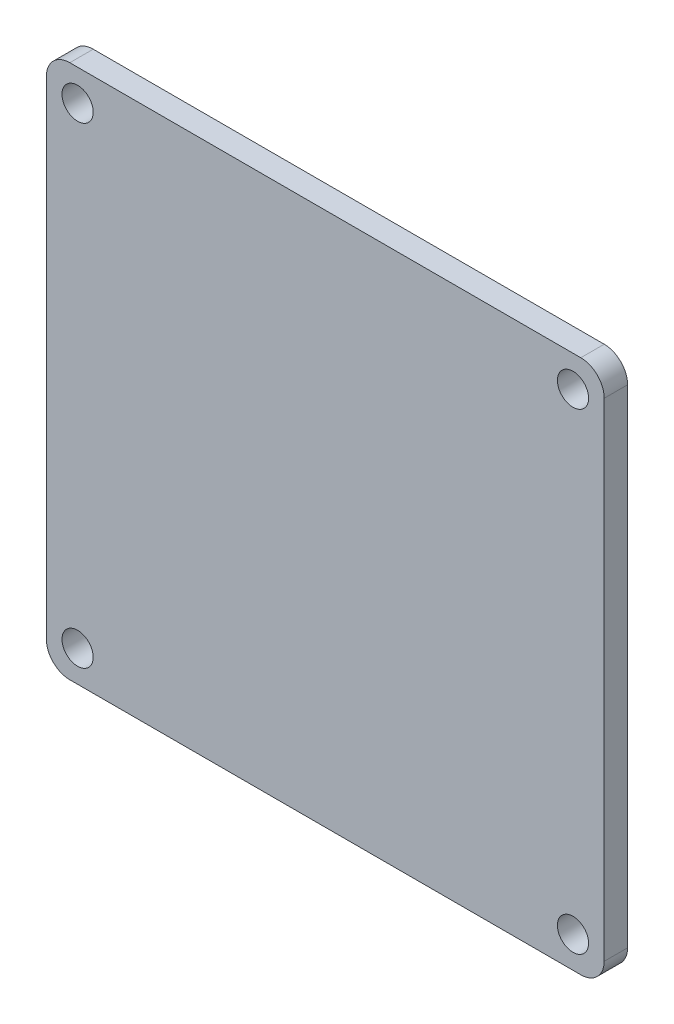
ISO-10303-21;
HEADER;
FILE_DESCRIPTION(('STEP AP214'),'2;1');
FILE_NAME('part.step','',(''),(''),'','','');
FILE_SCHEMA(('AUTOMOTIVE_DESIGN { 1 0 10303 214 1 1 1 1 }'));
ENDSEC;
DATA;
#1=APPLICATION_CONTEXT('core data for automotive mechanical design processes');
#2=APPLICATION_PROTOCOL_DEFINITION('international standard','automotive_design',2000,#1);
#3=PRODUCT_CONTEXT('',#1,'mechanical');
#4=PRODUCT('Part','Part','',(#3));
#5=PRODUCT_RELATED_PRODUCT_CATEGORY('part','',(#4));
#6=PRODUCT_DEFINITION_FORMATION('','',#4);
#7=PRODUCT_DEFINITION_CONTEXT('part definition',#1,'design');
#8=PRODUCT_DEFINITION('design','',#6,#7);
#9=PRODUCT_DEFINITION_SHAPE('','',#8);
#10=(LENGTH_UNIT() NAMED_UNIT(*) SI_UNIT(.MILLI.,.METRE.));
#11=(NAMED_UNIT(*) PLANE_ANGLE_UNIT() SI_UNIT($,.RADIAN.));
#12=(NAMED_UNIT(*) SI_UNIT($,.STERADIAN.) SOLID_ANGLE_UNIT());
#13=UNCERTAINTY_MEASURE_WITH_UNIT(LENGTH_MEASURE(1.E-05),#10,'distance_accuracy_value','');
#14=(GEOMETRIC_REPRESENTATION_CONTEXT(3) GLOBAL_UNCERTAINTY_ASSIGNED_CONTEXT((#13)) GLOBAL_UNIT_ASSIGNED_CONTEXT((#10,
#11,#12)) REPRESENTATION_CONTEXT('',''));
#15=CARTESIAN_POINT('',(0.,0.,0.));
#16=DIRECTION('',(0.,0.,1.));
#17=DIRECTION('',(1.,0.,0.));
#18=AXIS2_PLACEMENT_3D('',#15,#16,#17);
#19=CARTESIAN_POINT('',(0.,0.,3.));
#20=DIRECTION('',(0.,0.,-1.));
#21=DIRECTION('',(-1.,0.,0.));
#22=AXIS2_PLACEMENT_3D('',#19,#20,#21);
#23=PLANE('',#22);
#24=DIRECTION('',(1.,0.,0.));
#25=VECTOR('',#24,1.);
#26=CARTESIAN_POINT('',(0.,0.,3.));
#27=LINE('',#26,#25);
#28=CARTESIAN_POINT('',(3.,0.,3.));
#29=VERTEX_POINT('',#28);
#30=CARTESIAN_POINT('',(68.5,0.,3.));
#31=VERTEX_POINT('',#30);
#32=EDGE_CURVE('E174',#29,#31,#27,.T.);
#33=ORIENTED_EDGE('',*,*,#32,.T.);
#34=CARTESIAN_POINT('',(68.5,3.,3.));
#35=DIRECTION('',(0.,0.,-1.));
#36=DIRECTION('',(-1.,0.,0.));
#37=AXIS2_PLACEMENT_3D('',#34,#35,#36);
#38=CIRCLE('',#37,3.);
#39=CARTESIAN_POINT('',(71.5,3.,3.));
#40=VERTEX_POINT('',#39);
#41=EDGE_CURVE('E155',#31,#40,#38,.F.);
#42=ORIENTED_EDGE('',*,*,#41,.T.);
#43=DIRECTION('',(0.,1.,0.));
#44=VECTOR('',#43,1.);
#45=CARTESIAN_POINT('',(71.5,0.,3.));
#46=LINE('',#45,#44);
#47=CARTESIAN_POINT('',(71.5,65.5,3.));
#48=VERTEX_POINT('',#47);
#49=EDGE_CURVE('E125',#40,#48,#46,.T.);
#50=ORIENTED_EDGE('',*,*,#49,.T.);
#51=CARTESIAN_POINT('',(68.5,65.5,3.));
#52=DIRECTION('',(0.,0.,-1.));
#53=DIRECTION('',(-1.,0.,0.));
#54=AXIS2_PLACEMENT_3D('',#51,#52,#53);
#55=CIRCLE('',#54,3.);
#56=CARTESIAN_POINT('',(68.5,68.5,3.));
#57=VERTEX_POINT('',#56);
#58=EDGE_CURVE('E61',#48,#57,#55,.F.);
#59=ORIENTED_EDGE('',*,*,#58,.T.);
#60=DIRECTION('',(-1.,0.,0.));
#61=VECTOR('',#60,1.);
#62=CARTESIAN_POINT('',(0.,68.5,3.));
#63=LINE('',#62,#61);
#64=CARTESIAN_POINT('',(3.,68.5,3.));
#65=VERTEX_POINT('',#64);
#66=EDGE_CURVE('E141',#57,#65,#63,.T.);
#67=ORIENTED_EDGE('',*,*,#66,.T.);
#68=CARTESIAN_POINT('',(3.,65.5,3.));
#69=DIRECTION('',(0.,0.,-1.));
#70=DIRECTION('',(-1.,0.,0.));
#71=AXIS2_PLACEMENT_3D('',#68,#69,#70);
#72=CIRCLE('',#71,3.);
#73=CARTESIAN_POINT('',(0.,65.5,3.));
#74=VERTEX_POINT('',#73);
#75=EDGE_CURVE('E152',#65,#74,#72,.F.);
#76=ORIENTED_EDGE('',*,*,#75,.T.);
#77=DIRECTION('',(0.,-1.,0.));
#78=VECTOR('',#77,1.);
#79=CARTESIAN_POINT('',(0.,0.,3.));
#80=LINE('',#79,#78);
#81=CARTESIAN_POINT('',(0.,3.,3.));
#82=VERTEX_POINT('',#81);
#83=EDGE_CURVE('E135',#74,#82,#80,.T.);
#84=ORIENTED_EDGE('',*,*,#83,.T.);
#85=CARTESIAN_POINT('',(3.,3.,3.));
#86=DIRECTION('',(0.,0.,-1.));
#87=DIRECTION('',(-1.,0.,0.));
#88=AXIS2_PLACEMENT_3D('',#85,#86,#87);
#89=CIRCLE('',#88,3.);
#90=EDGE_CURVE('E150',#82,#29,#89,.F.);
#91=ORIENTED_EDGE('',*,*,#90,.T.);
#92=EDGE_LOOP('',(#33,#42,#50,#59,#67,#76,#84,#91));
#93=FACE_BOUND('',#92,.T.);
#94=CARTESIAN_POINT('',(4.,64.5,3.));
#95=DIRECTION('',(0.,0.,1.));
#96=DIRECTION('',(1.,0.,0.));
#97=AXIS2_PLACEMENT_3D('',#94,#95,#96);
#98=CIRCLE('',#97,2.);
#99=CARTESIAN_POINT('',(6.,64.5,3.));
#100=VERTEX_POINT('',#99);
#101=EDGE_CURVE('E179',#100,#100,#98,.T.);
#102=ORIENTED_EDGE('',*,*,#101,.F.);
#103=EDGE_LOOP('',(#102));
#104=FACE_BOUND('',#103,.T.);
#105=CARTESIAN_POINT('',(67.5,64.5,3.));
#106=DIRECTION('',(0.,0.,1.));
#107=DIRECTION('',(-1.,0.,0.));
#108=AXIS2_PLACEMENT_3D('',#105,#106,#107);
#109=CIRCLE('',#108,2.);
#110=CARTESIAN_POINT('',(65.5,64.5,3.));
#111=VERTEX_POINT('',#110);
#112=EDGE_CURVE('E188',#111,#111,#109,.T.);
#113=ORIENTED_EDGE('',*,*,#112,.F.);
#114=EDGE_LOOP('',(#113));
#115=FACE_BOUND('',#114,.T.);
#116=CARTESIAN_POINT('',(67.5,4.,3.));
#117=DIRECTION('',(0.,0.,1.));
#118=DIRECTION('',(1.,0.,0.));
#119=AXIS2_PLACEMENT_3D('',#116,#117,#118);
#120=CIRCLE('',#119,2.);
#121=CARTESIAN_POINT('',(69.5,4.,3.));
#122=VERTEX_POINT('',#121);
#123=EDGE_CURVE('E193',#122,#122,#120,.T.);
#124=ORIENTED_EDGE('',*,*,#123,.F.);
#125=EDGE_LOOP('',(#124));
#126=FACE_BOUND('',#125,.T.);
#127=CARTESIAN_POINT('',(4.,4.,3.));
#128=DIRECTION('',(0.,0.,1.));
#129=DIRECTION('',(-1.,0.,0.));
#130=AXIS2_PLACEMENT_3D('',#127,#128,#129);
#131=CIRCLE('',#130,2.);
#132=CARTESIAN_POINT('',(2.,4.,3.));
#133=VERTEX_POINT('',#132);
#134=EDGE_CURVE('E199',#133,#133,#131,.T.);
#135=ORIENTED_EDGE('',*,*,#134,.F.);
#136=EDGE_LOOP('',(#135));
#137=FACE_BOUND('',#136,.T.);
#138=ADVANCED_FACE('F39',(#93,#104,#115,#126,#137),#23,.F.);
#139=CARTESIAN_POINT('',(0.,0.,0.));
#140=DIRECTION('',(0.,0.,-1.));
#141=DIRECTION('',(-1.,0.,0.));
#142=AXIS2_PLACEMENT_3D('',#139,#140,#141);
#143=PLANE('',#142);
#144=CARTESIAN_POINT('',(67.5,4.,0.));
#145=DIRECTION('',(0.,0.,1.));
#146=DIRECTION('',(1.,0.,0.));
#147=AXIS2_PLACEMENT_3D('',#144,#145,#146);
#148=CIRCLE('',#147,2.);
#149=CARTESIAN_POINT('',(69.5,4.,0.));
#150=VERTEX_POINT('',#149);
#151=EDGE_CURVE('E196',#150,#150,#148,.T.);
#152=ORIENTED_EDGE('',*,*,#151,.T.);
#153=EDGE_LOOP('',(#152));
#154=FACE_BOUND('',#153,.T.);
#155=CARTESIAN_POINT('',(4.,64.5,0.));
#156=DIRECTION('',(0.,0.,1.));
#157=DIRECTION('',(1.,0.,0.));
#158=AXIS2_PLACEMENT_3D('',#155,#156,#157);
#159=CIRCLE('',#158,2.);
#160=CARTESIAN_POINT('',(6.,64.5,0.));
#161=VERTEX_POINT('',#160);
#162=EDGE_CURVE('E181',#161,#161,#159,.T.);
#163=ORIENTED_EDGE('',*,*,#162,.T.);
#164=EDGE_LOOP('',(#163));
#165=FACE_BOUND('',#164,.T.);
#166=DIRECTION('',(0.,1.,0.));
#167=VECTOR('',#166,1.);
#168=CARTESIAN_POINT('',(71.5,0.,0.));
#169=LINE('',#168,#167);
#170=CARTESIAN_POINT('',(71.5,3.,0.));
#171=VERTEX_POINT('',#170);
#172=CARTESIAN_POINT('',(71.5,65.5,0.));
#173=VERTEX_POINT('',#172);
#174=EDGE_CURVE('E123',#171,#173,#169,.T.);
#175=ORIENTED_EDGE('',*,*,#174,.F.);
#176=CARTESIAN_POINT('',(68.5,3.,0.));
#177=DIRECTION('',(0.,0.,-1.));
#178=DIRECTION('',(-1.,0.,0.));
#179=AXIS2_PLACEMENT_3D('',#176,#177,#178);
#180=CIRCLE('',#179,3.);
#181=CARTESIAN_POINT('',(68.5,0.,0.));
#182=VERTEX_POINT('',#181);
#183=EDGE_CURVE('E106',#171,#182,#180,.T.);
#184=ORIENTED_EDGE('',*,*,#183,.T.);
#185=DIRECTION('',(1.,0.,0.));
#186=VECTOR('',#185,1.);
#187=CARTESIAN_POINT('',(0.,0.,0.));
#188=LINE('',#187,#186);
#189=CARTESIAN_POINT('',(3.,0.,0.));
#190=VERTEX_POINT('',#189);
#191=EDGE_CURVE('E133',#190,#182,#188,.T.);
#192=ORIENTED_EDGE('',*,*,#191,.F.);
#193=CARTESIAN_POINT('',(3.,3.,0.));
#194=DIRECTION('',(0.,0.,-1.));
#195=DIRECTION('',(-1.,0.,0.));
#196=AXIS2_PLACEMENT_3D('',#193,#194,#195);
#197=CIRCLE('',#196,3.);
#198=CARTESIAN_POINT('',(0.,3.,0.));
#199=VERTEX_POINT('',#198);
#200=EDGE_CURVE('E126',#190,#199,#197,.T.);
#201=ORIENTED_EDGE('',*,*,#200,.T.);
#202=DIRECTION('',(0.,-1.,0.));
#203=VECTOR('',#202,1.);
#204=CARTESIAN_POINT('',(0.,0.,0.));
#205=LINE('',#204,#203);
#206=CARTESIAN_POINT('',(0.,65.5,0.));
#207=VERTEX_POINT('',#206);
#208=EDGE_CURVE('E137',#207,#199,#205,.T.);
#209=ORIENTED_EDGE('',*,*,#208,.F.);
#210=CARTESIAN_POINT('',(3.,65.5,0.));
#211=DIRECTION('',(0.,0.,-1.));
#212=DIRECTION('',(-1.,0.,0.));
#213=AXIS2_PLACEMENT_3D('',#210,#211,#212);
#214=CIRCLE('',#213,3.);
#215=CARTESIAN_POINT('',(3.,68.5,0.));
#216=VERTEX_POINT('',#215);
#217=EDGE_CURVE('E144',#207,#216,#214,.T.);
#218=ORIENTED_EDGE('',*,*,#217,.T.);
#219=DIRECTION('',(-1.,0.,0.));
#220=VECTOR('',#219,1.);
#221=CARTESIAN_POINT('',(0.,68.5,0.));
#222=LINE('',#221,#220);
#223=CARTESIAN_POINT('',(68.5,68.5,0.));
#224=VERTEX_POINT('',#223);
#225=EDGE_CURVE('E132',#224,#216,#222,.T.);
#226=ORIENTED_EDGE('',*,*,#225,.F.);
#227=CARTESIAN_POINT('',(68.5,65.5,0.));
#228=DIRECTION('',(0.,0.,-1.));
#229=DIRECTION('',(-1.,0.,0.));
#230=AXIS2_PLACEMENT_3D('',#227,#228,#229);
#231=CIRCLE('',#230,3.);
#232=EDGE_CURVE('E117',#224,#173,#231,.T.);
#233=ORIENTED_EDGE('',*,*,#232,.T.);
#234=EDGE_LOOP('',(#175,#184,#192,#201,#209,#218,#226,#233));
#235=FACE_BOUND('',#234,.T.);
#236=CARTESIAN_POINT('',(67.5,64.5,0.));
#237=DIRECTION('',(0.,0.,1.));
#238=DIRECTION('',(-1.,0.,0.));
#239=AXIS2_PLACEMENT_3D('',#236,#237,#238);
#240=CIRCLE('',#239,2.);
#241=CARTESIAN_POINT('',(65.5,64.5,0.));
#242=VERTEX_POINT('',#241);
#243=EDGE_CURVE('E190',#242,#242,#240,.T.);
#244=ORIENTED_EDGE('',*,*,#243,.T.);
#245=EDGE_LOOP('',(#244));
#246=FACE_BOUND('',#245,.T.);
#247=CARTESIAN_POINT('',(4.,4.,0.));
#248=DIRECTION('',(0.,0.,1.));
#249=DIRECTION('',(-1.,0.,0.));
#250=AXIS2_PLACEMENT_3D('',#247,#248,#249);
#251=CIRCLE('',#250,2.);
#252=CARTESIAN_POINT('',(2.,4.,0.));
#253=VERTEX_POINT('',#252);
#254=EDGE_CURVE('E202',#253,#253,#251,.T.);
#255=ORIENTED_EDGE('',*,*,#254,.T.);
#256=EDGE_LOOP('',(#255));
#257=FACE_BOUND('',#256,.T.);
#258=ADVANCED_FACE('F129',(#154,#165,#235,#246,#257),#143,.T.);
#259=CARTESIAN_POINT('',(0.,0.,3.));
#260=DIRECTION('',(1.,0.,0.));
#261=DIRECTION('',(0.,0.,-1.));
#262=AXIS2_PLACEMENT_3D('',#259,#260,#261);
#263=PLANE('',#262);
#264=ORIENTED_EDGE('',*,*,#83,.F.);
#265=DIRECTION('',(0.,0.,-1.));
#266=VECTOR('',#265,1.);
#267=CARTESIAN_POINT('',(0.,65.5,3.));
#268=LINE('',#267,#266);
#269=EDGE_CURVE('E11',#74,#207,#268,.T.);
#270=ORIENTED_EDGE('',*,*,#269,.T.);
#271=ORIENTED_EDGE('',*,*,#208,.T.);
#272=DIRECTION('',(0.,0.,-1.));
#273=VECTOR('',#272,1.);
#274=CARTESIAN_POINT('',(0.,3.,3.));
#275=LINE('',#274,#273);
#276=EDGE_CURVE('E47',#199,#82,#275,.F.);
#277=ORIENTED_EDGE('',*,*,#276,.T.);
#278=EDGE_LOOP('',(#264,#270,#271,#277));
#279=FACE_BOUND('',#278,.T.);
#280=ADVANCED_FACE('F165',(#279),#263,.F.);
#281=CARTESIAN_POINT('',(0.,0.,3.));
#282=DIRECTION('',(0.,1.,0.));
#283=DIRECTION('',(0.,0.,1.));
#284=AXIS2_PLACEMENT_3D('',#281,#282,#283);
#285=PLANE('',#284);
#286=ORIENTED_EDGE('',*,*,#191,.T.);
#287=DIRECTION('',(0.,0.,-1.));
#288=VECTOR('',#287,1.);
#289=CARTESIAN_POINT('',(68.5,0.,3.));
#290=LINE('',#289,#288);
#291=EDGE_CURVE('E111',#182,#31,#290,.F.);
#292=ORIENTED_EDGE('',*,*,#291,.T.);
#293=ORIENTED_EDGE('',*,*,#32,.F.);
#294=DIRECTION('',(0.,0.,-1.));
#295=VECTOR('',#294,1.);
#296=CARTESIAN_POINT('',(3.,0.,3.));
#297=LINE('',#296,#295);
#298=EDGE_CURVE('E116',#29,#190,#297,.T.);
#299=ORIENTED_EDGE('',*,*,#298,.T.);
#300=EDGE_LOOP('',(#286,#292,#293,#299));
#301=FACE_BOUND('',#300,.T.);
#302=ADVANCED_FACE('F178',(#301),#285,.F.);
#303=CARTESIAN_POINT('',(71.5,0.,3.));
#304=DIRECTION('',(-1.,0.,0.));
#305=DIRECTION('',(0.,0.,1.));
#306=AXIS2_PLACEMENT_3D('',#303,#304,#305);
#307=PLANE('',#306);
#308=ORIENTED_EDGE('',*,*,#49,.F.);
#309=DIRECTION('',(0.,0.,-1.));
#310=VECTOR('',#309,1.);
#311=CARTESIAN_POINT('',(71.5,3.,3.));
#312=LINE('',#311,#310);
#313=EDGE_CURVE('E110',#40,#171,#312,.T.);
#314=ORIENTED_EDGE('',*,*,#313,.T.);
#315=ORIENTED_EDGE('',*,*,#174,.T.);
#316=DIRECTION('',(0.,0.,-1.));
#317=VECTOR('',#316,1.);
#318=CARTESIAN_POINT('',(71.5,65.5,3.));
#319=LINE('',#318,#317);
#320=EDGE_CURVE('E127',#173,#48,#319,.F.);
#321=ORIENTED_EDGE('',*,*,#320,.T.);
#322=EDGE_LOOP('',(#308,#314,#315,#321));
#323=FACE_BOUND('',#322,.T.);
#324=ADVANCED_FACE('F122',(#323),#307,.F.);
#325=CARTESIAN_POINT('',(0.,68.5,3.));
#326=DIRECTION('',(0.,-1.,0.));
#327=DIRECTION('',(0.,0.,-1.));
#328=AXIS2_PLACEMENT_3D('',#325,#326,#327);
#329=PLANE('',#328);
#330=ORIENTED_EDGE('',*,*,#66,.F.);
#331=DIRECTION('',(0.,0.,-1.));
#332=VECTOR('',#331,1.);
#333=CARTESIAN_POINT('',(68.5,68.5,3.));
#334=LINE('',#333,#332);
#335=EDGE_CURVE('E158',#57,#224,#334,.T.);
#336=ORIENTED_EDGE('',*,*,#335,.T.);
#337=ORIENTED_EDGE('',*,*,#225,.T.);
#338=DIRECTION('',(0.,0.,-1.));
#339=VECTOR('',#338,1.);
#340=CARTESIAN_POINT('',(3.,68.5,3.));
#341=LINE('',#340,#339);
#342=EDGE_CURVE('E54',#216,#65,#341,.F.);
#343=ORIENTED_EDGE('',*,*,#342,.T.);
#344=EDGE_LOOP('',(#330,#336,#337,#343));
#345=FACE_BOUND('',#344,.T.);
#346=ADVANCED_FACE('F223',(#345),#329,.F.);
#347=CARTESIAN_POINT('',(4.,64.5,3.));
#348=DIRECTION('',(0.,0.,-1.));
#349=DIRECTION('',(-1.,0.,0.));
#350=AXIS2_PLACEMENT_3D('',#347,#348,#349);
#351=CYLINDRICAL_SURFACE('',#350,2.);
#352=ORIENTED_EDGE('',*,*,#101,.T.);
#353=EDGE_LOOP('',(#352));
#354=FACE_BOUND('',#353,.T.);
#355=ORIENTED_EDGE('',*,*,#162,.F.);
#356=EDGE_LOOP('',(#355));
#357=FACE_BOUND('',#356,.T.);
#358=ADVANCED_FACE('F220',(#354,#357),#351,.F.);
#359=CARTESIAN_POINT('',(67.5,64.5,3.));
#360=DIRECTION('',(0.,0.,-1.));
#361=DIRECTION('',(-1.,0.,0.));
#362=AXIS2_PLACEMENT_3D('',#359,#360,#361);
#363=CYLINDRICAL_SURFACE('',#362,2.);
#364=ORIENTED_EDGE('',*,*,#112,.T.);
#365=EDGE_LOOP('',(#364));
#366=FACE_BOUND('',#365,.T.);
#367=ORIENTED_EDGE('',*,*,#243,.F.);
#368=EDGE_LOOP('',(#367));
#369=FACE_BOUND('',#368,.T.);
#370=ADVANCED_FACE('F279',(#366,#369),#363,.F.);
#371=CARTESIAN_POINT('',(67.5,4.,3.));
#372=DIRECTION('',(0.,0.,-1.));
#373=DIRECTION('',(-1.,0.,0.));
#374=AXIS2_PLACEMENT_3D('',#371,#372,#373);
#375=CYLINDRICAL_SURFACE('',#374,2.);
#376=ORIENTED_EDGE('',*,*,#123,.T.);
#377=EDGE_LOOP('',(#376));
#378=FACE_BOUND('',#377,.T.);
#379=ORIENTED_EDGE('',*,*,#151,.F.);
#380=EDGE_LOOP('',(#379));
#381=FACE_BOUND('',#380,.T.);
#382=ADVANCED_FACE('F270',(#378,#381),#375,.F.);
#383=CARTESIAN_POINT('',(4.,4.,3.));
#384=DIRECTION('',(0.,0.,-1.));
#385=DIRECTION('',(-1.,0.,0.));
#386=AXIS2_PLACEMENT_3D('',#383,#384,#385);
#387=CYLINDRICAL_SURFACE('',#386,2.);
#388=ORIENTED_EDGE('',*,*,#134,.T.);
#389=EDGE_LOOP('',(#388));
#390=FACE_BOUND('',#389,.T.);
#391=ORIENTED_EDGE('',*,*,#254,.F.);
#392=EDGE_LOOP('',(#391));
#393=FACE_BOUND('',#392,.T.);
#394=ADVANCED_FACE('F208',(#390,#393),#387,.F.);
#395=CARTESIAN_POINT('',(68.5,3.,3.));
#396=DIRECTION('',(0.,0.,-1.));
#397=DIRECTION('',(-1.,0.,0.));
#398=AXIS2_PLACEMENT_3D('',#395,#396,#397);
#399=CYLINDRICAL_SURFACE('',#398,3.);
#400=ORIENTED_EDGE('',*,*,#41,.F.);
#401=ORIENTED_EDGE('',*,*,#291,.F.);
#402=ORIENTED_EDGE('',*,*,#183,.F.);
#403=ORIENTED_EDGE('',*,*,#313,.F.);
#404=EDGE_LOOP('',(#400,#401,#402,#403));
#405=FACE_BOUND('',#404,.T.);
#406=ADVANCED_FACE('F109',(#405),#399,.T.);
#407=CARTESIAN_POINT('',(68.5,65.5,3.));
#408=DIRECTION('',(0.,0.,-1.));
#409=DIRECTION('',(-1.,0.,0.));
#410=AXIS2_PLACEMENT_3D('',#407,#408,#409);
#411=CYLINDRICAL_SURFACE('',#410,3.);
#412=ORIENTED_EDGE('',*,*,#58,.F.);
#413=ORIENTED_EDGE('',*,*,#320,.F.);
#414=ORIENTED_EDGE('',*,*,#232,.F.);
#415=ORIENTED_EDGE('',*,*,#335,.F.);
#416=EDGE_LOOP('',(#412,#413,#414,#415));
#417=FACE_BOUND('',#416,.T.);
#418=ADVANCED_FACE('F234',(#417),#411,.T.);
#419=CARTESIAN_POINT('',(3.,65.5,3.));
#420=DIRECTION('',(0.,0.,-1.));
#421=DIRECTION('',(-1.,0.,0.));
#422=AXIS2_PLACEMENT_3D('',#419,#420,#421);
#423=CYLINDRICAL_SURFACE('',#422,3.);
#424=ORIENTED_EDGE('',*,*,#75,.F.);
#425=ORIENTED_EDGE('',*,*,#342,.F.);
#426=ORIENTED_EDGE('',*,*,#217,.F.);
#427=ORIENTED_EDGE('',*,*,#269,.F.);
#428=EDGE_LOOP('',(#424,#425,#426,#427));
#429=FACE_BOUND('',#428,.T.);
#430=ADVANCED_FACE('F236',(#429),#423,.T.);
#431=CARTESIAN_POINT('',(3.,3.,3.));
#432=DIRECTION('',(0.,0.,-1.));
#433=DIRECTION('',(-1.,0.,0.));
#434=AXIS2_PLACEMENT_3D('',#431,#432,#433);
#435=CYLINDRICAL_SURFACE('',#434,3.);
#436=ORIENTED_EDGE('',*,*,#90,.F.);
#437=ORIENTED_EDGE('',*,*,#276,.F.);
#438=ORIENTED_EDGE('',*,*,#200,.F.);
#439=ORIENTED_EDGE('',*,*,#298,.F.);
#440=EDGE_LOOP('',(#436,#437,#438,#439));
#441=FACE_BOUND('',#440,.T.);
#442=ADVANCED_FACE('F41',(#441),#435,.T.);
#443=CLOSED_SHELL('',(#138,#258,#280,#302,#324,#346,#358,#370,#382,#394,#406,#418,#430,#442));
#444=MANIFOLD_SOLID_BREP('B2',#443);
#445=ADVANCED_BREP_SHAPE_REPRESENTATION('',(#18,#444),#14);
#446=SHAPE_DEFINITION_REPRESENTATION(#9,#445);
ENDSEC;
END-ISO-10303-21;
